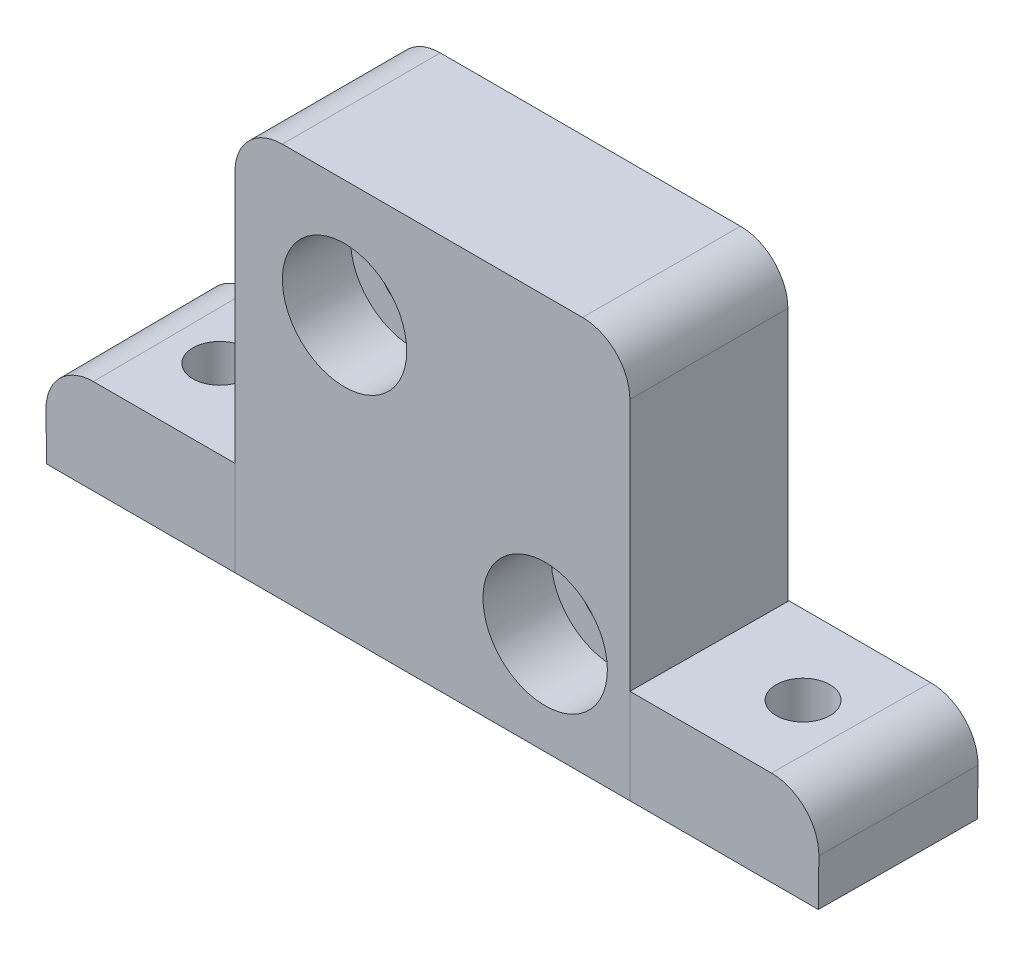
ISO-10303-21;
HEADER;
FILE_DESCRIPTION(('STEP AP214'),'2;1');
FILE_NAME('part.step','',(''),(''),'','','');
FILE_SCHEMA(('AUTOMOTIVE_DESIGN { 1 0 10303 214 1 1 1 1 }'));
ENDSEC;
DATA;
#1=APPLICATION_CONTEXT('core data for automotive mechanical design processes');
#2=APPLICATION_PROTOCOL_DEFINITION('international standard','automotive_design',2000,#1);
#3=PRODUCT_CONTEXT('',#1,'mechanical');
#4=PRODUCT('Part','Part','',(#3));
#5=PRODUCT_RELATED_PRODUCT_CATEGORY('part','',(#4));
#6=PRODUCT_DEFINITION_FORMATION('','',#4);
#7=PRODUCT_DEFINITION_CONTEXT('part definition',#1,'design');
#8=PRODUCT_DEFINITION('design','',#6,#7);
#9=PRODUCT_DEFINITION_SHAPE('','',#8);
#10=(LENGTH_UNIT() NAMED_UNIT(*) SI_UNIT(.MILLI.,.METRE.));
#11=(NAMED_UNIT(*) PLANE_ANGLE_UNIT() SI_UNIT($,.RADIAN.));
#12=(NAMED_UNIT(*) SI_UNIT($,.STERADIAN.) SOLID_ANGLE_UNIT());
#13=UNCERTAINTY_MEASURE_WITH_UNIT(LENGTH_MEASURE(1.E-05),#10,'distance_accuracy_value','');
#14=(GEOMETRIC_REPRESENTATION_CONTEXT(3) GLOBAL_UNCERTAINTY_ASSIGNED_CONTEXT((#13)) GLOBAL_UNIT_ASSIGNED_CONTEXT((#10,
#11,#12)) REPRESENTATION_CONTEXT('',''));
#15=CARTESIAN_POINT('',(0.,0.,0.));
#16=DIRECTION('',(0.,0.,1.));
#17=DIRECTION('',(1.,0.,0.));
#18=AXIS2_PLACEMENT_3D('',#15,#16,#17);
#19=CARTESIAN_POINT('',(12.5,-12.5,10.));
#20=DIRECTION('',(-1.,0.,0.));
#21=DIRECTION('',(0.,0.,1.));
#22=AXIS2_PLACEMENT_3D('',#19,#20,#21);
#23=PLANE('',#22);
#24=DIRECTION('',(0.,1.,0.));
#25=VECTOR('',#24,1.);
#26=CARTESIAN_POINT('',(12.5,-12.5,0.));
#27=LINE('',#26,#25);
#28=CARTESIAN_POINT('',(12.5,-12.5,0.));
#29=VERTEX_POINT('',#28);
#30=CARTESIAN_POINT('',(12.5,9.5,0.));
#31=VERTEX_POINT('',#30);
#32=EDGE_CURVE('E213',#29,#31,#27,.T.);
#33=ORIENTED_EDGE('',*,*,#32,.T.);
#34=DIRECTION('',(0.,0.,-1.));
#35=VECTOR('',#34,1.);
#36=CARTESIAN_POINT('',(12.5,9.5,10.));
#37=LINE('',#36,#35);
#38=CARTESIAN_POINT('',(12.5,9.5,10.));
#39=VERTEX_POINT('',#38);
#40=EDGE_CURVE('E398',#31,#39,#37,.F.);
#41=ORIENTED_EDGE('',*,*,#40,.T.);
#42=DIRECTION('',(0.,1.,0.));
#43=VECTOR('',#42,1.);
#44=CARTESIAN_POINT('',(12.5,-12.5,10.));
#45=LINE('',#44,#43);
#46=CARTESIAN_POINT('',(12.5,-6.5,10.));
#47=VERTEX_POINT('',#46);
#48=EDGE_CURVE('E246',#47,#39,#45,.T.);
#49=ORIENTED_EDGE('',*,*,#48,.F.);
#50=DIRECTION('',(0.,0.514495755427529,0.857492925712543));
#51=VECTOR('',#50,1.);
#52=CARTESIAN_POINT('',(12.5,-8.08823529411732,7.35294117647037));
#53=LINE('',#52,#51);
#54=EDGE_CURVE('E251',#29,#47,#53,.T.);
#55=ORIENTED_EDGE('',*,*,#54,.F.);
#56=EDGE_LOOP('',(#33,#41,#49,#55));
#57=FACE_BOUND('',#56,.T.);
#58=ADVANCED_FACE('F107',(#57),#23,.F.);
#59=DIRECTION('',(0.,-0.999999998970095,-4.53851375097376E-05));
#60=VECTOR('',#59,1.);
#61=CARTESIAN_POINT('',(12.5,-12.4999999876411,9.99972768917522));
#62=LINE('',#61,#60);
#63=CARTESIAN_POINT('',(12.5,-12.499546182952,9.99972770977121));
#64=VERTEX_POINT('',#63);
#65=EDGE_CURVE('E269',#47,#64,#62,.T.);
#66=ORIENTED_EDGE('',*,*,#65,.F.);
#67=CARTESIAN_POINT('',(12.5,-12.5,10.));
#68=VERTEX_POINT('',#67);
#69=EDGE_CURVE('E237',#68,#47,#45,.T.);
#70=ORIENTED_EDGE('',*,*,#69,.F.);
#71=DIRECTION('',(0.,0.,-1.));
#72=VECTOR('',#71,1.);
#73=CARTESIAN_POINT('',(12.5,-12.5,10.));
#74=LINE('',#73,#72);
#75=EDGE_CURVE('E231',#68,#29,#74,.T.);
#76=ORIENTED_EDGE('',*,*,#75,.T.);
#77=DIRECTION('',(0.,-4.53829404844477E-05,-0.999999998970194));
#78=VECTOR('',#77,1.);
#79=CARTESIAN_POINT('',(12.5,-12.4995461705956,9.99999997940389));
#80=LINE('',#79,#78);
#81=EDGE_CURVE('E234',#64,#29,#80,.T.);
#82=ORIENTED_EDGE('',*,*,#81,.F.);
#83=EDGE_LOOP('',(#66,#70,#76,#82));
#84=FACE_BOUND('',#83,.T.);
#85=ADVANCED_FACE('F232',(#84),#23,.F.);
#86=CARTESIAN_POINT('',(-12.5,-12.5,10.));
#87=DIRECTION('',(1.,0.,0.));
#88=DIRECTION('',(0.,0.,-1.));
#89=AXIS2_PLACEMENT_3D('',#86,#87,#88);
#90=PLANE('',#89);
#91=DIRECTION('',(0.,-1.,0.));
#92=VECTOR('',#91,1.);
#93=CARTESIAN_POINT('',(-12.5,-12.5,10.));
#94=LINE('',#93,#92);
#95=CARTESIAN_POINT('',(-12.5,9.5,10.));
#96=VERTEX_POINT('',#95);
#97=CARTESIAN_POINT('',(-12.5,-6.5,10.));
#98=VERTEX_POINT('',#97);
#99=EDGE_CURVE('E389',#96,#98,#94,.T.);
#100=ORIENTED_EDGE('',*,*,#99,.F.);
#101=DIRECTION('',(0.,0.,-1.));
#102=VECTOR('',#101,1.);
#103=CARTESIAN_POINT('',(-12.5,9.5,10.));
#104=LINE('',#103,#102);
#105=CARTESIAN_POINT('',(-12.5,9.5,0.));
#106=VERTEX_POINT('',#105);
#107=EDGE_CURVE('E403',#96,#106,#104,.T.);
#108=ORIENTED_EDGE('',*,*,#107,.T.);
#109=DIRECTION('',(0.,-1.,0.));
#110=VECTOR('',#109,1.);
#111=CARTESIAN_POINT('',(-12.5,-12.5,0.));
#112=LINE('',#111,#110);
#113=CARTESIAN_POINT('',(-12.5,-12.5,0.));
#114=VERTEX_POINT('',#113);
#115=EDGE_CURVE('E247',#106,#114,#112,.T.);
#116=ORIENTED_EDGE('',*,*,#115,.T.);
#117=DIRECTION('',(0.,0.514495755427527,0.857492925712544));
#118=VECTOR('',#117,1.);
#119=CARTESIAN_POINT('',(-12.5,-8.08823529411707,7.35294117647024));
#120=LINE('',#119,#118);
#121=EDGE_CURVE('E324',#114,#98,#120,.T.);
#122=ORIENTED_EDGE('',*,*,#121,.T.);
#123=EDGE_LOOP('',(#100,#108,#116,#122));
#124=FACE_BOUND('',#123,.T.);
#125=ADVANCED_FACE('F458',(#124),#90,.F.);
#126=CARTESIAN_POINT('',(-5.563,5.0876,10.));
#127=DIRECTION('',(0.,0.,-1.));
#128=DIRECTION('',(-1.,0.,0.));
#129=AXIS2_PLACEMENT_3D('',#126,#127,#128);
#130=CYLINDRICAL_SURFACE('',#129,2.2225);
#131=CARTESIAN_POINT('',(-5.563,5.0876,0.));
#132=DIRECTION('',(0.,0.,1.));
#133=DIRECTION('',(1.,0.,0.));
#134=AXIS2_PLACEMENT_3D('',#131,#132,#133);
#135=CIRCLE('',#134,2.2225);
#136=CARTESIAN_POINT('',(-3.3405,5.0876,0.));
#137=VERTEX_POINT('',#136);
#138=EDGE_CURVE('E226',#137,#137,#135,.T.);
#139=ORIENTED_EDGE('',*,*,#138,.F.);
#140=EDGE_LOOP('',(#139));
#141=FACE_BOUND('',#140,.T.);
#142=CARTESIAN_POINT('',(-5.563,5.0876,5.682));
#143=DIRECTION('',(0.,0.,1.));
#144=DIRECTION('',(1.,0.,0.));
#145=AXIS2_PLACEMENT_3D('',#142,#143,#144);
#146=CIRCLE('',#145,2.2225);
#147=CARTESIAN_POINT('',(-3.3405,5.0876,5.682));
#148=VERTEX_POINT('',#147);
#149=EDGE_CURVE('E347',#148,#148,#146,.T.);
#150=ORIENTED_EDGE('',*,*,#149,.T.);
#151=EDGE_LOOP('',(#150));
#152=FACE_BOUND('',#151,.T.);
#153=ADVANCED_FACE('F500',(#141,#152),#130,.F.);
#154=CARTESIAN_POINT('',(7.137,-6.0376,10.));
#155=DIRECTION('',(0.,0.,-1.));
#156=DIRECTION('',(-1.,0.,0.));
#157=AXIS2_PLACEMENT_3D('',#154,#155,#156);
#158=CYLINDRICAL_SURFACE('',#157,2.2225);
#159=CARTESIAN_POINT('',(7.137,-6.0376,0.));
#160=DIRECTION('',(0.,0.,1.));
#161=DIRECTION('',(1.,0.,0.));
#162=AXIS2_PLACEMENT_3D('',#159,#160,#161);
#163=CIRCLE('',#162,2.2225);
#164=CARTESIAN_POINT('',(9.3595,-6.0376,0.));
#165=VERTEX_POINT('',#164);
#166=EDGE_CURVE('E344',#165,#165,#163,.T.);
#167=ORIENTED_EDGE('',*,*,#166,.F.);
#168=EDGE_LOOP('',(#167));
#169=FACE_BOUND('',#168,.T.);
#170=CARTESIAN_POINT('',(7.137,-6.0376,5.682));
#171=DIRECTION('',(0.,0.,1.));
#172=DIRECTION('',(1.,0.,0.));
#173=AXIS2_PLACEMENT_3D('',#170,#171,#172);
#174=CIRCLE('',#173,2.2225);
#175=CARTESIAN_POINT('',(9.3595,-6.0376,5.682));
#176=VERTEX_POINT('',#175);
#177=EDGE_CURVE('E335',#176,#176,#174,.T.);
#178=ORIENTED_EDGE('',*,*,#177,.T.);
#179=EDGE_LOOP('',(#178));
#180=FACE_BOUND('',#179,.T.);
#181=ADVANCED_FACE('F518',(#169,#180),#158,.F.);
#182=CARTESIAN_POINT('',(0.,0.,10.));
#183=DIRECTION('',(0.,0.,-1.));
#184=DIRECTION('',(-1.,0.,0.));
#185=AXIS2_PLACEMENT_3D('',#182,#183,#184);
#186=PLANE('',#185);
#187=CARTESIAN_POINT('',(-5.563,5.0876,10.));
#188=DIRECTION('',(0.,0.,1.));
#189=DIRECTION('',(1.,0.,0.));
#190=AXIS2_PLACEMENT_3D('',#187,#188,#189);
#191=CIRCLE('',#190,3.937);
#192=CARTESIAN_POINT('',(-1.626,5.0876,10.));
#193=VERTEX_POINT('',#192);
#194=EDGE_CURVE('E336',#193,#193,#191,.T.);
#195=ORIENTED_EDGE('',*,*,#194,.F.);
#196=EDGE_LOOP('',(#195));
#197=FACE_BOUND('',#196,.T.);
#198=CARTESIAN_POINT('',(7.137,-6.0376,10.));
#199=DIRECTION('',(0.,0.,1.));
#200=DIRECTION('',(1.,0.,0.));
#201=AXIS2_PLACEMENT_3D('',#198,#199,#200);
#202=CIRCLE('',#201,3.937);
#203=CARTESIAN_POINT('',(11.074,-6.0376,10.));
#204=VERTEX_POINT('',#203);
#205=EDGE_CURVE('E339',#204,#204,#202,.T.);
#206=ORIENTED_EDGE('',*,*,#205,.F.);
#207=EDGE_LOOP('',(#206));
#208=FACE_BOUND('',#207,.T.);
#209=ORIENTED_EDGE('',*,*,#48,.T.);
#210=CARTESIAN_POINT('',(9.5,9.5,10.));
#211=DIRECTION('',(0.,0.,-1.));
#212=DIRECTION('',(-1.,0.,0.));
#213=AXIS2_PLACEMENT_3D('',#210,#211,#212);
#214=CIRCLE('',#213,3.);
#215=CARTESIAN_POINT('',(9.5,12.5,10.));
#216=VERTEX_POINT('',#215);
#217=EDGE_CURVE('E401',#39,#216,#214,.F.);
#218=ORIENTED_EDGE('',*,*,#217,.T.);
#219=DIRECTION('',(-1.,0.,0.));
#220=VECTOR('',#219,1.);
#221=CARTESIAN_POINT('',(-12.5,12.5,10.));
#222=LINE('',#221,#220);
#223=CARTESIAN_POINT('',(-9.5,12.5,10.));
#224=VERTEX_POINT('',#223);
#225=EDGE_CURVE('E352',#216,#224,#222,.T.);
#226=ORIENTED_EDGE('',*,*,#225,.T.);
#227=CARTESIAN_POINT('',(-9.5,9.5,10.));
#228=DIRECTION('',(0.,0.,-1.));
#229=DIRECTION('',(-1.,0.,0.));
#230=AXIS2_PLACEMENT_3D('',#227,#228,#229);
#231=CIRCLE('',#230,3.);
#232=EDGE_CURVE('E399',#224,#96,#231,.F.);
#233=ORIENTED_EDGE('',*,*,#232,.T.);
#234=ORIENTED_EDGE('',*,*,#99,.T.);
#235=CARTESIAN_POINT('',(-12.5,-12.5,10.));
#236=VERTEX_POINT('',#235);
#237=EDGE_CURVE('E387',#98,#236,#94,.T.);
#238=ORIENTED_EDGE('',*,*,#237,.T.);
#239=DIRECTION('',(1.,0.,0.));
#240=VECTOR('',#239,1.);
#241=CARTESIAN_POINT('',(-12.5,-12.5,10.));
#242=LINE('',#241,#240);
#243=EDGE_CURVE('E241',#236,#68,#242,.T.);
#244=ORIENTED_EDGE('',*,*,#243,.T.);
#245=ORIENTED_EDGE('',*,*,#69,.T.);
#246=EDGE_LOOP('',(#209,#218,#226,#233,#234,#238,#244,#245));
#247=FACE_BOUND('',#246,.T.);
#248=ADVANCED_FACE('F483',(#197,#208,#247),#186,.F.);
#249=CARTESIAN_POINT('',(0.,0.,0.));
#250=DIRECTION('',(0.,0.,-1.));
#251=DIRECTION('',(-1.,0.,0.));
#252=AXIS2_PLACEMENT_3D('',#249,#250,#251);
#253=PLANE('',#252);
#254=ORIENTED_EDGE('',*,*,#138,.T.);
#255=EDGE_LOOP('',(#254));
#256=FACE_BOUND('',#255,.T.);
#257=DIRECTION('',(-1.,0.,0.));
#258=VECTOR('',#257,1.);
#259=CARTESIAN_POINT('',(-12.5,12.5,0.));
#260=LINE('',#259,#258);
#261=CARTESIAN_POINT('',(9.5,12.5,0.));
#262=VERTEX_POINT('',#261);
#263=CARTESIAN_POINT('',(-9.5,12.5,0.));
#264=VERTEX_POINT('',#263);
#265=EDGE_CURVE('E225',#262,#264,#260,.T.);
#266=ORIENTED_EDGE('',*,*,#265,.F.);
#267=CARTESIAN_POINT('',(9.5,9.5,0.));
#268=DIRECTION('',(0.,0.,-1.));
#269=DIRECTION('',(-1.,0.,0.));
#270=AXIS2_PLACEMENT_3D('',#267,#268,#269);
#271=CIRCLE('',#270,3.);
#272=EDGE_CURVE('E221',#262,#31,#271,.T.);
#273=ORIENTED_EDGE('',*,*,#272,.T.);
#274=ORIENTED_EDGE('',*,*,#32,.F.);
#275=DIRECTION('',(1.,0.,0.));
#276=VECTOR('',#275,1.);
#277=CARTESIAN_POINT('',(-12.5,-12.5,0.));
#278=LINE('',#277,#276);
#279=EDGE_CURVE('E220',#114,#29,#278,.T.);
#280=ORIENTED_EDGE('',*,*,#279,.F.);
#281=ORIENTED_EDGE('',*,*,#115,.F.);
#282=CARTESIAN_POINT('',(-9.5,9.5,0.));
#283=DIRECTION('',(0.,0.,-1.));
#284=DIRECTION('',(-1.,0.,0.));
#285=AXIS2_PLACEMENT_3D('',#282,#283,#284);
#286=CIRCLE('',#285,3.);
#287=EDGE_CURVE('E370',#106,#264,#286,.T.);
#288=ORIENTED_EDGE('',*,*,#287,.T.);
#289=EDGE_LOOP('',(#266,#273,#274,#280,#281,#288));
#290=FACE_BOUND('',#289,.T.);
#291=ORIENTED_EDGE('',*,*,#166,.T.);
#292=EDGE_LOOP('',(#291));
#293=FACE_BOUND('',#292,.T.);
#294=ADVANCED_FACE('F216',(#256,#290,#293),#253,.T.);
#295=CARTESIAN_POINT('',(-12.5,12.5,10.));
#296=DIRECTION('',(0.,-1.,0.));
#297=DIRECTION('',(0.,0.,-1.));
#298=AXIS2_PLACEMENT_3D('',#295,#296,#297);
#299=PLANE('',#298);
#300=ORIENTED_EDGE('',*,*,#225,.F.);
#301=DIRECTION('',(0.,0.,-1.));
#302=VECTOR('',#301,1.);
#303=CARTESIAN_POINT('',(9.5,12.5,10.));
#304=LINE('',#303,#302);
#305=EDGE_CURVE('E367',#216,#262,#304,.T.);
#306=ORIENTED_EDGE('',*,*,#305,.T.);
#307=ORIENTED_EDGE('',*,*,#265,.T.);
#308=DIRECTION('',(0.,0.,-1.));
#309=VECTOR('',#308,1.);
#310=CARTESIAN_POINT('',(-9.5,12.5,10.));
#311=LINE('',#310,#309);
#312=EDGE_CURVE('E365',#264,#224,#311,.F.);
#313=ORIENTED_EDGE('',*,*,#312,.T.);
#314=EDGE_LOOP('',(#300,#306,#307,#313));
#315=FACE_BOUND('',#314,.T.);
#316=ADVANCED_FACE('F461',(#315),#299,.F.);
#317=ORIENTED_EDGE('',*,*,#237,.F.);
#318=DIRECTION('',(0.,-0.999999998970095,-4.53851375097376E-05));
#319=VECTOR('',#318,1.);
#320=CARTESIAN_POINT('',(-12.5,-12.4999999876411,9.99972768917522));
#321=LINE('',#320,#319);
#322=CARTESIAN_POINT('',(-12.5,-12.499546182952,9.99972770977121));
#323=VERTEX_POINT('',#322);
#324=EDGE_CURVE('E270',#98,#323,#321,.T.);
#325=ORIENTED_EDGE('',*,*,#324,.T.);
#326=DIRECTION('',(0.,-4.53829404844477E-05,-0.999999998970194));
#327=VECTOR('',#326,1.);
#328=CARTESIAN_POINT('',(-12.5,-12.4995461705956,9.99999997940389));
#329=LINE('',#328,#327);
#330=EDGE_CURVE('E321',#323,#114,#329,.T.);
#331=ORIENTED_EDGE('',*,*,#330,.T.);
#332=DIRECTION('',(0.,0.,-1.));
#333=VECTOR('',#332,1.);
#334=CARTESIAN_POINT('',(-12.5,-12.5,10.));
#335=LINE('',#334,#333);
#336=EDGE_CURVE('E240',#236,#114,#335,.T.);
#337=ORIENTED_EDGE('',*,*,#336,.F.);
#338=EDGE_LOOP('',(#317,#325,#331,#337));
#339=FACE_BOUND('',#338,.T.);
#340=ADVANCED_FACE('F489',(#339),#90,.F.);
#341=CARTESIAN_POINT('',(-12.5,-12.5,10.));
#342=DIRECTION('',(0.,1.,0.));
#343=DIRECTION('',(0.,0.,1.));
#344=AXIS2_PLACEMENT_3D('',#341,#342,#343);
#345=PLANE('',#344);
#346=ORIENTED_EDGE('',*,*,#279,.T.);
#347=ORIENTED_EDGE('',*,*,#75,.F.);
#348=ORIENTED_EDGE('',*,*,#243,.F.);
#349=ORIENTED_EDGE('',*,*,#336,.T.);
#350=EDGE_LOOP('',(#346,#347,#348,#349));
#351=FACE_BOUND('',#350,.T.);
#352=ADVANCED_FACE('F244',(#351),#345,.F.);
#353=CARTESIAN_POINT('',(7.137,-6.0376,5.682));
#354=DIRECTION('',(0.,0.,1.));
#355=DIRECTION('',(1.,0.,0.));
#356=AXIS2_PLACEMENT_3D('',#353,#354,#355);
#357=CYLINDRICAL_SURFACE('',#356,3.937);
#358=CARTESIAN_POINT('',(7.137,-6.0376,5.682));
#359=DIRECTION('',(0.,0.,1.));
#360=DIRECTION('',(1.,0.,0.));
#361=AXIS2_PLACEMENT_3D('',#358,#359,#360);
#362=CIRCLE('',#361,3.937);
#363=CARTESIAN_POINT('',(11.074,-6.0376,5.682));
#364=VERTEX_POINT('',#363);
#365=EDGE_CURVE('E329',#364,#364,#362,.T.);
#366=ORIENTED_EDGE('',*,*,#365,.F.);
#367=EDGE_LOOP('',(#366));
#368=FACE_BOUND('',#367,.T.);
#369=ORIENTED_EDGE('',*,*,#205,.T.);
#370=EDGE_LOOP('',(#369));
#371=FACE_BOUND('',#370,.T.);
#372=ADVANCED_FACE('F522',(#368,#371),#357,.F.);
#373=CARTESIAN_POINT('',(7.137,-6.0376,5.682));
#374=DIRECTION('',(0.,0.,1.));
#375=DIRECTION('',(1.,0.,0.));
#376=AXIS2_PLACEMENT_3D('',#373,#374,#375);
#377=PLANE('',#376);
#378=ORIENTED_EDGE('',*,*,#177,.F.);
#379=EDGE_LOOP('',(#378));
#380=FACE_BOUND('',#379,.T.);
#381=ORIENTED_EDGE('',*,*,#365,.T.);
#382=EDGE_LOOP('',(#381));
#383=FACE_BOUND('',#382,.T.);
#384=ADVANCED_FACE('F512',(#380,#383),#377,.T.);
#385=CARTESIAN_POINT('',(-5.563,5.0876,5.682));
#386=DIRECTION('',(0.,0.,1.));
#387=DIRECTION('',(1.,0.,0.));
#388=AXIS2_PLACEMENT_3D('',#385,#386,#387);
#389=CYLINDRICAL_SURFACE('',#388,3.937);
#390=CARTESIAN_POINT('',(-5.563,5.0876,5.682));
#391=DIRECTION('',(0.,0.,1.));
#392=DIRECTION('',(1.,0.,0.));
#393=AXIS2_PLACEMENT_3D('',#390,#391,#392);
#394=CIRCLE('',#393,3.937);
#395=CARTESIAN_POINT('',(-1.626,5.0876,5.682));
#396=VERTEX_POINT('',#395);
#397=EDGE_CURVE('E332',#396,#396,#394,.T.);
#398=ORIENTED_EDGE('',*,*,#397,.F.);
#399=EDGE_LOOP('',(#398));
#400=FACE_BOUND('',#399,.T.);
#401=ORIENTED_EDGE('',*,*,#194,.T.);
#402=EDGE_LOOP('',(#401));
#403=FACE_BOUND('',#402,.T.);
#404=ADVANCED_FACE('F506',(#400,#403),#389,.F.);
#405=CARTESIAN_POINT('',(-5.563,5.0876,5.682));
#406=DIRECTION('',(0.,0.,1.));
#407=DIRECTION('',(1.,0.,0.));
#408=AXIS2_PLACEMENT_3D('',#405,#406,#407);
#409=PLANE('',#408);
#410=ORIENTED_EDGE('',*,*,#149,.F.);
#411=EDGE_LOOP('',(#410));
#412=FACE_BOUND('',#411,.T.);
#413=ORIENTED_EDGE('',*,*,#397,.T.);
#414=EDGE_LOOP('',(#413));
#415=FACE_BOUND('',#414,.T.);
#416=ADVANCED_FACE('F502',(#412,#415),#409,.T.);
#417=CARTESIAN_POINT('',(-12.4262062029444,-12.499546182952,9.99972770977121));
#418=DIRECTION('',(0.,-4.53851375097376E-05,0.999999998970095));
#419=DIRECTION('',(0.,-0.999999998970095,-4.53851375097376E-05));
#420=AXIS2_PLACEMENT_3D('',#417,#418,#419);
#421=PLANE('',#420);
#422=DIRECTION('',(-1.,0.,0.));
#423=VECTOR('',#422,1.);
#424=CARTESIAN_POINT('',(-12.5,-6.5,10.));
#425=LINE('',#424,#423);
#426=CARTESIAN_POINT('',(-21.4627896735762,-6.5,10.));
#427=VERTEX_POINT('',#426);
#428=EDGE_CURVE('E300',#98,#427,#425,.T.);
#429=ORIENTED_EDGE('',*,*,#428,.T.);
#430=CARTESIAN_POINT('',(-21.4627916830672,-9.50000000926855,9.99986384458691));
#431=DIRECTION('',(0.,-4.53851375097376E-05,0.999999998970095));
#432=DIRECTION('',(0.999924364855164,0.0122989661632977,5.58190271123757E-07));
#433=AXIS2_PLACEMENT_3D('',#430,#431,#432);
#434=ELLIPSE('',#433,3.00008169856206,3.);
#435=CARTESIAN_POINT('',(-24.4626464700155,-9.53689791256618,9.99986216997049));
#436=VERTEX_POINT('',#435);
#437=EDGE_CURVE('E414',#427,#436,#434,.T.);
#438=ORIENTED_EDGE('',*,*,#437,.T.);
#439=DIRECTION('',(-0.0122989661759266,0.999924363825337,4.53817047982886E-05));
#440=VECTOR('',#439,1.);
#441=CARTESIAN_POINT('',(-24.4262062029444,-12.499546182952,9.99972770977121));
#442=LINE('',#441,#440);
#443=CARTESIAN_POINT('',(-24.4262062029444,-12.499546182952,9.99972770977121));
#444=VERTEX_POINT('',#443);
#445=EDGE_CURVE('E318',#444,#436,#442,.T.);
#446=ORIENTED_EDGE('',*,*,#445,.F.);
#447=DIRECTION('',(-1.,0.,0.));
#448=VECTOR('',#447,1.);
#449=CARTESIAN_POINT('',(-12.4262062029444,-12.499546182952,9.99972770977121));
#450=LINE('',#449,#448);
#451=EDGE_CURVE('E314',#323,#444,#450,.T.);
#452=ORIENTED_EDGE('',*,*,#451,.F.);
#453=ORIENTED_EDGE('',*,*,#324,.F.);
#454=EDGE_LOOP('',(#429,#438,#446,#452,#453));
#455=FACE_BOUND('',#454,.T.);
#456=ADVANCED_FACE('F505',(#455),#421,.T.);
#457=CARTESIAN_POINT('',(-12.6511497653313,-0.155612070116722,0.0933672420700335));
#458=DIRECTION('',(0.999897134802458,0.0122989661759265,-0.00737937970555589));
#459=DIRECTION('',(-0.0122993010612109,0.999924360736054,0.));
#460=AXIS2_PLACEMENT_3D('',#457,#458,#459);
#461=PLANE('',#460);
#462=ORIENTED_EDGE('',*,*,#121,.F.);
#463=DIRECTION('',(0.0122989661759272,-0.999924363825337,-4.53817047978594E-05));
#464=VECTOR('',#463,1.);
#465=CARTESIAN_POINT('',(-12.5,-12.5,0.));
#466=LINE('',#465,#464);
#467=CARTESIAN_POINT('',(-12.5737937970556,-6.50045381704798,0.000272290228787157));
#468=VERTEX_POINT('',#467);
#469=EDGE_CURVE('E301',#468,#114,#466,.T.);
#470=ORIENTED_EDGE('',*,*,#469,.F.);
#471=DIRECTION('',(-0.0073793797055563,-4.53817047979706E-05,-0.999972770977121));
#472=VECTOR('',#471,1.);
#473=CARTESIAN_POINT('',(-12.5737937970556,-6.50045381704798,0.000272290228787157));
#474=LINE('',#473,#472);
#475=EDGE_CURVE('E789',#98,#468,#474,.T.);
#476=ORIENTED_EDGE('',*,*,#475,.F.);
#477=EDGE_LOOP('',(#462,#470,#476));
#478=FACE_BOUND('',#477,.T.);
#479=ADVANCED_FACE('F670',(#478),#461,.T.);
#480=CARTESIAN_POINT('',(-12.5,-12.5,0.));
#481=DIRECTION('',(0.,-0.999999998970194,4.53829404844477E-05));
#482=DIRECTION('',(0.,-4.53829404844477E-05,-0.999999998970194));
#483=AXIS2_PLACEMENT_3D('',#480,#481,#482);
#484=PLANE('',#483);
#485=CARTESIAN_POINT('',(-18.462939729065,-12.499773091476,4.9998638548856));
#486=DIRECTION('',(0.,-0.999999998970194,4.53829404844477E-05));
#487=DIRECTION('',(0.,-4.53829404844477E-05,-0.999999998970194));
#488=AXIS2_PLACEMENT_3D('',#485,#486,#487);
#489=ELLIPSE('',#488,1.70000000175067,1.7);
#490=CARTESIAN_POINT('',(-18.462939729065,-12.4998502424749,3.2998638548856));
#491=VERTEX_POINT('',#490);
#492=EDGE_CURVE('E439',#491,#491,#489,.T.);
#493=ORIENTED_EDGE('',*,*,#492,.F.);
#494=EDGE_LOOP('',(#493));
#495=FACE_BOUND('',#494,.T.);
#496=ORIENTED_EDGE('',*,*,#330,.F.);
#497=ORIENTED_EDGE('',*,*,#451,.T.);
#498=DIRECTION('',(0.00737937970555595,4.53817047980573E-05,0.999972770977121));
#499=VECTOR('',#498,1.);
#500=CARTESIAN_POINT('',(-24.5,-12.5,0.));
#501=LINE('',#500,#499);
#502=CARTESIAN_POINT('',(-24.5,-12.5,0.));
#503=VERTEX_POINT('',#502);
#504=EDGE_CURVE('E317',#503,#444,#501,.T.);
#505=ORIENTED_EDGE('',*,*,#504,.F.);
#506=DIRECTION('',(-1.,0.,0.));
#507=VECTOR('',#506,1.);
#508=CARTESIAN_POINT('',(-12.5,-12.5,0.));
#509=LINE('',#508,#507);
#510=EDGE_CURVE('E297',#114,#503,#509,.T.);
#511=ORIENTED_EDGE('',*,*,#510,.F.);
#512=EDGE_LOOP('',(#496,#497,#505,#511));
#513=FACE_BOUND('',#512,.T.);
#514=ADVANCED_FACE('F647',(#495,#513),#484,.T.);
#515=CARTESIAN_POINT('',(-24.6511497653313,-0.155612070116722,0.0933672420700335));
#516=DIRECTION('',(0.999897134802458,0.0122989661759265,-0.00737937970555589));
#517=DIRECTION('',(-0.0122993010612109,0.999924360736054,0.));
#518=AXIS2_PLACEMENT_3D('',#515,#516,#517);
#519=PLANE('',#518);
#520=ORIENTED_EDGE('',*,*,#445,.T.);
#521=DIRECTION('',(-0.00737937970555589,-4.53817047979706E-05,-0.999972770977121));
#522=VECTOR('',#521,1.);
#523=CARTESIAN_POINT('',(-24.536440267071,-9.53735172961416,0.000134460199281103));
#524=LINE('',#523,#522);
#525=CARTESIAN_POINT('',(-24.5364402670711,-9.53735172961416,0.000134460199281657));
#526=VERTEX_POINT('',#525);
#527=EDGE_CURVE('E406',#436,#526,#524,.T.);
#528=ORIENTED_EDGE('',*,*,#527,.T.);
#529=DIRECTION('',(0.0122989661759272,-0.999924363825337,-4.53817047978594E-05));
#530=VECTOR('',#529,1.);
#531=CARTESIAN_POINT('',(-24.5,-12.5,0.));
#532=LINE('',#531,#530);
#533=EDGE_CURVE('E257',#526,#503,#532,.T.);
#534=ORIENTED_EDGE('',*,*,#533,.T.);
#535=ORIENTED_EDGE('',*,*,#504,.T.);
#536=EDGE_LOOP('',(#520,#528,#534,#535));
#537=FACE_BOUND('',#536,.T.);
#538=ADVANCED_FACE('F635',(#537),#519,.F.);
#539=CARTESIAN_POINT('',(-12.5,-12.5,0.));
#540=DIRECTION('',(0.,4.53851375093084E-05,-0.999999998970095));
#541=DIRECTION('',(0.,0.999999998970095,4.53851375093084E-05));
#542=AXIS2_PLACEMENT_3D('',#539,#540,#541);
#543=PLANE('',#542);
#544=ORIENTED_EDGE('',*,*,#533,.F.);
#545=CARTESIAN_POINT('',(-21.5365854801228,-9.50045382631653,0.000136134815698346));
#546=DIRECTION('',(0.,4.53851375093084E-05,-0.999999998970095));
#547=DIRECTION('',(0.999924364855164,0.0122989661632395,5.5819027111584E-07));
#548=AXIS2_PLACEMENT_3D('',#545,#546,#547);
#549=ELLIPSE('',#548,3.00008169856206,3.);
#550=CARTESIAN_POINT('',(-21.5365834706317,-6.50045381704798,0.000272290228787157));
#551=VERTEX_POINT('',#550);
#552=EDGE_CURVE('E410',#526,#551,#549,.T.);
#553=ORIENTED_EDGE('',*,*,#552,.T.);
#554=DIRECTION('',(-1.,0.,0.));
#555=VECTOR('',#554,1.);
#556=CARTESIAN_POINT('',(-12.5737937970556,-6.50045381704798,0.000272290228787157));
#557=LINE('',#556,#555);
#558=EDGE_CURVE('E306',#468,#551,#557,.T.);
#559=ORIENTED_EDGE('',*,*,#558,.F.);
#560=ORIENTED_EDGE('',*,*,#469,.T.);
#561=ORIENTED_EDGE('',*,*,#510,.T.);
#562=EDGE_LOOP('',(#544,#553,#559,#560,#561));
#563=FACE_BOUND('',#562,.T.);
#564=ADVANCED_FACE('F644',(#563),#543,.T.);
#565=CARTESIAN_POINT('',(-12.5737937970556,-6.50045381704798,0.000272290228787157));
#566=DIRECTION('',(0.,0.999999998970194,-4.5382940484361E-05));
#567=DIRECTION('',(0.,4.5382940484361E-05,0.999999998970194));
#568=AXIS2_PLACEMENT_3D('',#565,#566,#567);
#569=PLANE('',#568);
#570=CARTESIAN_POINT('',(-18.462939729065,-6.50022692088132,4.9998638548856));
#571=DIRECTION('',(0.,0.999999998970194,-4.5382940484361E-05));
#572=DIRECTION('',(0.,-4.5382940484361E-05,-0.999999998970195));
#573=AXIS2_PLACEMENT_3D('',#570,#571,#572);
#574=ELLIPSE('',#573,1.70000000175067,1.7);
#575=CARTESIAN_POINT('',(-18.462939729065,-6.50030407188022,3.2998638548856));
#576=VERTEX_POINT('',#575);
#577=EDGE_CURVE('E770',#576,#576,#574,.F.);
#578=ORIENTED_EDGE('',*,*,#577,.T.);
#579=EDGE_LOOP('',(#578));
#580=FACE_BOUND('',#579,.T.);
#581=ORIENTED_EDGE('',*,*,#558,.T.);
#582=DIRECTION('',(-0.00737937970555589,-4.53817047979706E-05,-0.999972770977121));
#583=VECTOR('',#582,1.);
#584=CARTESIAN_POINT('',(-21.4629550656081,-6.50000101712782,9.97758788203238));
#585=LINE('',#584,#583);
#586=EDGE_CURVE('E412',#551,#427,#585,.F.);
#587=ORIENTED_EDGE('',*,*,#586,.T.);
#588=ORIENTED_EDGE('',*,*,#428,.F.);
#589=ORIENTED_EDGE('',*,*,#475,.T.);
#590=EDGE_LOOP('',(#581,#587,#588,#589));
#591=FACE_BOUND('',#590,.T.);
#592=ADVANCED_FACE('F633',(#580,#591),#569,.T.);
#593=CARTESIAN_POINT('',(12.4262062029444,-12.499546182952,9.99972770977121));
#594=DIRECTION('',(0.,4.53851375097376E-05,-0.999999998970095));
#595=DIRECTION('',(0.,0.999999998970095,4.53851375097376E-05));
#596=AXIS2_PLACEMENT_3D('',#593,#594,#595);
#597=PLANE('',#596);
#598=DIRECTION('',(0.0122989661759266,0.999924363825337,4.53817047982886E-05));
#599=VECTOR('',#598,1.);
#600=CARTESIAN_POINT('',(24.4262062029444,-12.499546182952,9.99972770977121));
#601=LINE('',#600,#599);
#602=CARTESIAN_POINT('',(24.4262062029444,-12.499546182952,9.99972770977121));
#603=VERTEX_POINT('',#602);
#604=CARTESIAN_POINT('',(24.4626464700155,-9.53689791256618,9.99986216997049));
#605=VERTEX_POINT('',#604);
#606=EDGE_CURVE('E295',#603,#605,#601,.T.);
#607=ORIENTED_EDGE('',*,*,#606,.T.);
#608=CARTESIAN_POINT('',(21.4627916830672,-9.50000000926855,9.99986384458691));
#609=DIRECTION('',(0.,4.53851375097376E-05,-0.999999998970095));
#610=DIRECTION('',(-0.999924364855164,0.0122989661632977,5.58190271123757E-07));
#611=AXIS2_PLACEMENT_3D('',#608,#609,#610);
#612=ELLIPSE('',#611,3.00008169856206,3.);
#613=CARTESIAN_POINT('',(21.4627896735762,-6.5,10.));
#614=VERTEX_POINT('',#613);
#615=EDGE_CURVE('E12',#605,#614,#612,.F.);
#616=ORIENTED_EDGE('',*,*,#615,.T.);
#617=DIRECTION('',(1.,0.,0.));
#618=VECTOR('',#617,1.);
#619=CARTESIAN_POINT('',(12.5,-6.5,10.));
#620=LINE('',#619,#618);
#621=EDGE_CURVE('E294',#47,#614,#620,.T.);
#622=ORIENTED_EDGE('',*,*,#621,.F.);
#623=ORIENTED_EDGE('',*,*,#65,.T.);
#624=DIRECTION('',(1.,0.,0.));
#625=VECTOR('',#624,1.);
#626=CARTESIAN_POINT('',(12.4262062029444,-12.499546182952,9.99972770977121));
#627=LINE('',#626,#625);
#628=EDGE_CURVE('E268',#64,#603,#627,.T.);
#629=ORIENTED_EDGE('',*,*,#628,.T.);
#630=EDGE_LOOP('',(#607,#616,#622,#623,#629));
#631=FACE_BOUND('',#630,.T.);
#632=ADVANCED_FACE('F443',(#631),#597,.F.);
#633=CARTESIAN_POINT('',(12.5,-12.5,0.));
#634=DIRECTION('',(0.,0.999999998970194,-4.53829404844477E-05));
#635=DIRECTION('',(0.,4.53829404844477E-05,0.999999998970194));
#636=AXIS2_PLACEMENT_3D('',#633,#634,#635);
#637=PLANE('',#636);
#638=CARTESIAN_POINT('',(18.462939729065,-12.499773091476,4.9998638548856));
#639=DIRECTION('',(0.,0.999999998970194,-4.53829404844477E-05));
#640=DIRECTION('',(0.,-4.53829404844477E-05,-0.999999998970194));
#641=AXIS2_PLACEMENT_3D('',#638,#639,#640);
#642=ELLIPSE('',#641,1.70000000175067,1.7);
#643=CARTESIAN_POINT('',(18.462939729065,-12.4998502424749,3.2998638548856));
#644=VERTEX_POINT('',#643);
#645=EDGE_CURVE('E768',#644,#644,#642,.T.);
#646=ORIENTED_EDGE('',*,*,#645,.T.);
#647=EDGE_LOOP('',(#646));
#648=FACE_BOUND('',#647,.T.);
#649=ORIENTED_EDGE('',*,*,#628,.F.);
#650=ORIENTED_EDGE('',*,*,#81,.T.);
#651=DIRECTION('',(1.,0.,0.));
#652=VECTOR('',#651,1.);
#653=CARTESIAN_POINT('',(12.5,-12.5,0.));
#654=LINE('',#653,#652);
#655=CARTESIAN_POINT('',(24.5,-12.5,0.));
#656=VERTEX_POINT('',#655);
#657=EDGE_CURVE('E266',#29,#656,#654,.T.);
#658=ORIENTED_EDGE('',*,*,#657,.T.);
#659=DIRECTION('',(-0.00737937970555595,4.53817047980573E-05,0.999972770977121));
#660=VECTOR('',#659,1.);
#661=CARTESIAN_POINT('',(24.5,-12.5,0.));
#662=LINE('',#661,#660);
#663=EDGE_CURVE('E258',#656,#603,#662,.T.);
#664=ORIENTED_EDGE('',*,*,#663,.T.);
#665=EDGE_LOOP('',(#649,#650,#658,#664));
#666=FACE_BOUND('',#665,.T.);
#667=ADVANCED_FACE('F264',(#648,#666),#637,.F.);
#668=CARTESIAN_POINT('',(12.6511497653313,-0.155612070116721,0.0933672420700335));
#669=DIRECTION('',(0.999897134802458,-0.0122989661759264,0.00737937970555589));
#670=DIRECTION('',(0.0122993010612108,0.999924360736054,0.));
#671=AXIS2_PLACEMENT_3D('',#668,#669,#670);
#672=PLANE('',#671);
#673=DIRECTION('',(-0.0122989661759272,-0.999924363825337,-4.53817047978594E-05));
#674=VECTOR('',#673,1.);
#675=CARTESIAN_POINT('',(12.5,-12.5,0.));
#676=LINE('',#675,#674);
#677=CARTESIAN_POINT('',(12.5737937970556,-6.50045381704798,0.000272290228787157));
#678=VERTEX_POINT('',#677);
#679=EDGE_CURVE('E273',#678,#29,#676,.T.);
#680=ORIENTED_EDGE('',*,*,#679,.T.);
#681=ORIENTED_EDGE('',*,*,#54,.T.);
#682=DIRECTION('',(0.0073793797055563,-4.53817047979706E-05,-0.999972770977121));
#683=VECTOR('',#682,1.);
#684=CARTESIAN_POINT('',(12.5737937970556,-6.50045381704798,0.000272290228787157));
#685=LINE('',#684,#683);
#686=EDGE_CURVE('E278',#47,#678,#685,.T.);
#687=ORIENTED_EDGE('',*,*,#686,.T.);
#688=EDGE_LOOP('',(#680,#681,#687));
#689=FACE_BOUND('',#688,.T.);
#690=ADVANCED_FACE('F277',(#689),#672,.F.);
#691=CARTESIAN_POINT('',(24.6511497653313,-0.155612070116721,0.0933672420700335));
#692=DIRECTION('',(0.999897134802458,-0.0122989661759264,0.00737937970555589));
#693=DIRECTION('',(0.0122993010612108,0.999924360736054,0.));
#694=AXIS2_PLACEMENT_3D('',#691,#692,#693);
#695=PLANE('',#694);
#696=DIRECTION('',(-0.0122989661759272,-0.999924363825337,-4.53817047978594E-05));
#697=VECTOR('',#696,1.);
#698=CARTESIAN_POINT('',(24.5,-12.5,0.));
#699=LINE('',#698,#697);
#700=CARTESIAN_POINT('',(24.5364402670711,-9.53735172961416,0.000134460199281657));
#701=VERTEX_POINT('',#700);
#702=EDGE_CURVE('E275',#701,#656,#699,.T.);
#703=ORIENTED_EDGE('',*,*,#702,.F.);
#704=DIRECTION('',(0.00737937970555589,-4.53817047979706E-05,-0.999972770977121));
#705=VECTOR('',#704,1.);
#706=CARTESIAN_POINT('',(24.4626464700155,-9.53689791256618,9.9998621699705));
#707=LINE('',#706,#705);
#708=EDGE_CURVE('E115',#701,#605,#707,.F.);
#709=ORIENTED_EDGE('',*,*,#708,.T.);
#710=ORIENTED_EDGE('',*,*,#606,.F.);
#711=ORIENTED_EDGE('',*,*,#663,.F.);
#712=EDGE_LOOP('',(#703,#709,#710,#711));
#713=FACE_BOUND('',#712,.T.);
#714=ADVANCED_FACE('F441',(#713),#695,.T.);
#715=CARTESIAN_POINT('',(12.5737937970556,-6.50045381704798,0.000272290228787157));
#716=DIRECTION('',(0.,-0.999999998970194,4.5382940484361E-05));
#717=DIRECTION('',(0.,-4.5382940484361E-05,-0.999999998970194));
#718=AXIS2_PLACEMENT_3D('',#715,#716,#717);
#719=PLANE('',#718);
#720=CARTESIAN_POINT('',(18.462939729065,-6.50022692088132,4.9998638548856));
#721=DIRECTION('',(0.,0.999999998970194,-4.5382940484361E-05));
#722=DIRECTION('',(0.,-4.5382940484361E-05,-0.999999998970195));
#723=AXIS2_PLACEMENT_3D('',#720,#721,#722);
#724=ELLIPSE('',#723,1.70000000175067,1.7);
#725=CARTESIAN_POINT('',(18.462939729065,-6.50030407188022,3.2998638548856));
#726=VERTEX_POINT('',#725);
#727=EDGE_CURVE('E775',#726,#726,#724,.F.);
#728=ORIENTED_EDGE('',*,*,#727,.T.);
#729=EDGE_LOOP('',(#728));
#730=FACE_BOUND('',#729,.T.);
#731=ORIENTED_EDGE('',*,*,#621,.T.);
#732=DIRECTION('',(0.00737937970555589,-4.53817047979706E-05,-0.999972770977121));
#733=VECTOR('',#732,1.);
#734=CARTESIAN_POINT('',(21.5367488626637,-6.5004548341758,-0.0221398277388396));
#735=LINE('',#734,#733);
#736=CARTESIAN_POINT('',(21.5365834706317,-6.50045381704798,0.000272290228787157));
#737=VERTEX_POINT('',#736);
#738=EDGE_CURVE('E416',#614,#737,#735,.T.);
#739=ORIENTED_EDGE('',*,*,#738,.T.);
#740=DIRECTION('',(1.,0.,0.));
#741=VECTOR('',#740,1.);
#742=CARTESIAN_POINT('',(12.5737937970556,-6.50045381704798,0.000272290228787157));
#743=LINE('',#742,#741);
#744=EDGE_CURVE('E280',#678,#737,#743,.T.);
#745=ORIENTED_EDGE('',*,*,#744,.F.);
#746=ORIENTED_EDGE('',*,*,#686,.F.);
#747=EDGE_LOOP('',(#731,#739,#745,#746));
#748=FACE_BOUND('',#747,.T.);
#749=ADVANCED_FACE('F422',(#730,#748),#719,.F.);
#750=CARTESIAN_POINT('',(12.5,-12.5,0.));
#751=DIRECTION('',(0.,-4.53851375093084E-05,0.999999998970095));
#752=DIRECTION('',(0.,-0.999999998970095,-4.53851375093084E-05));
#753=AXIS2_PLACEMENT_3D('',#750,#751,#752);
#754=PLANE('',#753);
#755=ORIENTED_EDGE('',*,*,#744,.T.);
#756=CARTESIAN_POINT('',(21.5365854801228,-9.50045382631653,0.000136134815698346));
#757=DIRECTION('',(0.,-4.53851375093084E-05,0.999999998970095));
#758=DIRECTION('',(-0.999924364855164,0.0122989661632395,5.5819027111584E-07));
#759=AXIS2_PLACEMENT_3D('',#756,#757,#758);
#760=ELLIPSE('',#759,3.00008169856206,3.);
#761=EDGE_CURVE('E129',#737,#701,#760,.F.);
#762=ORIENTED_EDGE('',*,*,#761,.T.);
#763=ORIENTED_EDGE('',*,*,#702,.T.);
#764=ORIENTED_EDGE('',*,*,#657,.F.);
#765=ORIENTED_EDGE('',*,*,#679,.F.);
#766=EDGE_LOOP('',(#755,#762,#763,#764,#765));
#767=FACE_BOUND('',#766,.T.);
#768=ADVANCED_FACE('F272',(#767),#754,.F.);
#769=CARTESIAN_POINT('',(9.5,9.5,10.));
#770=DIRECTION('',(0.,0.,-1.));
#771=DIRECTION('',(-1.,0.,0.));
#772=AXIS2_PLACEMENT_3D('',#769,#770,#771);
#773=CYLINDRICAL_SURFACE('',#772,3.);
#774=ORIENTED_EDGE('',*,*,#217,.F.);
#775=ORIENTED_EDGE('',*,*,#40,.F.);
#776=ORIENTED_EDGE('',*,*,#272,.F.);
#777=ORIENTED_EDGE('',*,*,#305,.F.);
#778=EDGE_LOOP('',(#774,#775,#776,#777));
#779=FACE_BOUND('',#778,.T.);
#780=ADVANCED_FACE('F463',(#779),#773,.T.);
#781=CARTESIAN_POINT('',(-9.5,9.5,10.));
#782=DIRECTION('',(0.,0.,-1.));
#783=DIRECTION('',(-1.,0.,0.));
#784=AXIS2_PLACEMENT_3D('',#781,#782,#783);
#785=CYLINDRICAL_SURFACE('',#784,3.);
#786=ORIENTED_EDGE('',*,*,#232,.F.);
#787=ORIENTED_EDGE('',*,*,#312,.F.);
#788=ORIENTED_EDGE('',*,*,#287,.F.);
#789=ORIENTED_EDGE('',*,*,#107,.F.);
#790=EDGE_LOOP('',(#786,#787,#788,#789));
#791=FACE_BOUND('',#790,.T.);
#792=ADVANCED_FACE('F466',(#791),#785,.T.);
#793=CARTESIAN_POINT('',(18.462939729065,-1.69190080633698,4.9998638548856));
#794=DIRECTION('',(0.,-1.,0.));
#795=DIRECTION('',(0.,0.,-1.));
#796=AXIS2_PLACEMENT_3D('',#793,#794,#795);
#797=CYLINDRICAL_SURFACE('',#796,1.7);
#798=ORIENTED_EDGE('',*,*,#727,.F.);
#799=EDGE_LOOP('',(#798));
#800=FACE_BOUND('',#799,.T.);
#801=ORIENTED_EDGE('',*,*,#645,.F.);
#802=EDGE_LOOP('',(#801));
#803=FACE_BOUND('',#802,.T.);
#804=ADVANCED_FACE('F469',(#800,#803),#797,.F.);
#805=CARTESIAN_POINT('',(-18.462939729065,-1.69190080633698,4.9998638548856));
#806=DIRECTION('',(0.,-1.,0.));
#807=DIRECTION('',(0.,0.,-1.));
#808=AXIS2_PLACEMENT_3D('',#805,#806,#807);
#809=CYLINDRICAL_SURFACE('',#808,1.7);
#810=ORIENTED_EDGE('',*,*,#492,.T.);
#811=EDGE_LOOP('',(#810));
#812=FACE_BOUND('',#811,.T.);
#813=ORIENTED_EDGE('',*,*,#577,.F.);
#814=EDGE_LOOP('',(#813));
#815=FACE_BOUND('',#814,.T.);
#816=ADVANCED_FACE('F449',(#812,#815),#809,.F.);
#817=CARTESIAN_POINT('',(-21.5360639859928,-9.50045061923225,0.0708033115995587));
#818=DIRECTION('',(0.00737937970555589,4.53817047979706E-05,0.999972770977121));
#819=DIRECTION('',(0.999972772006843,0.,-0.0073793797131548));
#820=AXIS2_PLACEMENT_3D('',#817,#818,#819);
#821=CYLINDRICAL_SURFACE('',#820,3.);
#822=ORIENTED_EDGE('',*,*,#437,.F.);
#823=ORIENTED_EDGE('',*,*,#586,.F.);
#824=ORIENTED_EDGE('',*,*,#552,.F.);
#825=ORIENTED_EDGE('',*,*,#527,.F.);
#826=EDGE_LOOP('',(#822,#823,#824,#825));
#827=FACE_BOUND('',#826,.T.);
#828=ADVANCED_FACE('F445',(#827),#821,.T.);
#829=CARTESIAN_POINT('',(21.5360953997256,-9.5004508124204,0.0665464663496981));
#830=DIRECTION('',(-0.00737937970555589,4.53817047979706E-05,0.999972770977121));
#831=DIRECTION('',(0.999972772006843,0.,0.0073793797131548));
#832=AXIS2_PLACEMENT_3D('',#829,#830,#831);
#833=CYLINDRICAL_SURFACE('',#832,3.);
#834=ORIENTED_EDGE('',*,*,#615,.F.);
#835=ORIENTED_EDGE('',*,*,#708,.F.);
#836=ORIENTED_EDGE('',*,*,#761,.F.);
#837=ORIENTED_EDGE('',*,*,#738,.F.);
#838=EDGE_LOOP('',(#834,#835,#836,#837));
#839=FACE_BOUND('',#838,.T.);
#840=ADVANCED_FACE('F109',(#839),#833,.T.);
#841=CLOSED_SHELL('',(#58,#85,#125,#153,#181,#248,#294,#316,#340,#352,#372,#384,#404,#416,#456,
#479,#514,#538,#564,#592,#632,#667,#690,#714,#749,#768,#780,#792,#804,#816,#828,#840));
#842=MANIFOLD_SOLID_BREP('B2',#841);
#843=ADVANCED_BREP_SHAPE_REPRESENTATION('',(#18,#842),#14);
#844=SHAPE_DEFINITION_REPRESENTATION(#9,#843);
ENDSEC;
END-ISO-10303-21;
